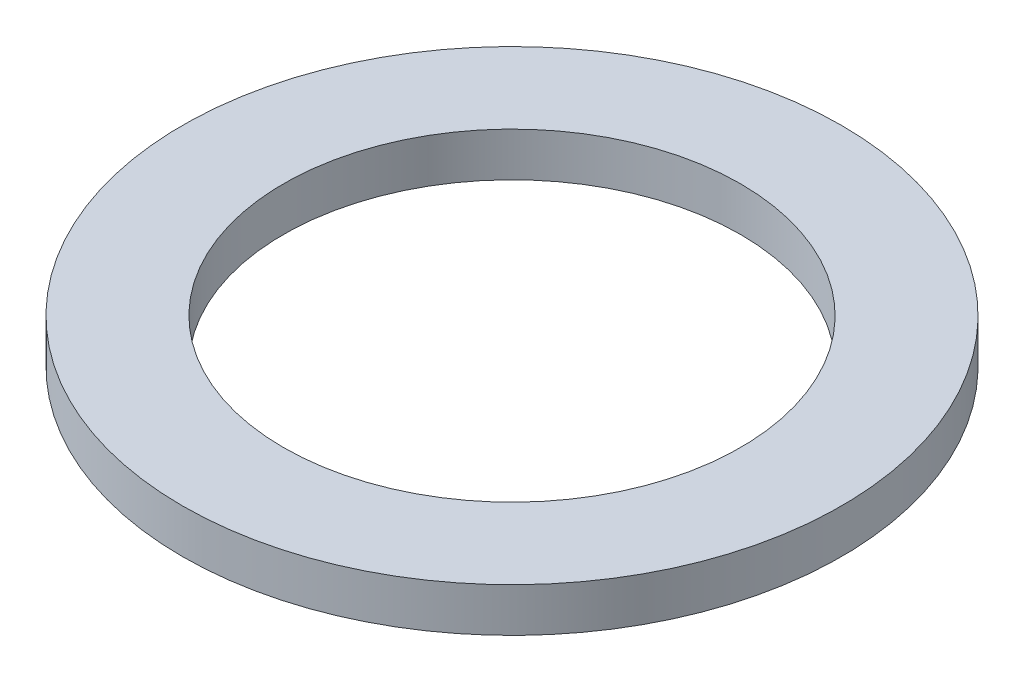
ISO-10303-21;
HEADER;
FILE_DESCRIPTION(('STEP AP214'),'2;1');
FILE_NAME('part.step','',(''),(''),'','','');
FILE_SCHEMA(('AUTOMOTIVE_DESIGN { 1 0 10303 214 1 1 1 1 }'));
ENDSEC;
DATA;
#1=APPLICATION_CONTEXT('core data for automotive mechanical design processes');
#2=APPLICATION_PROTOCOL_DEFINITION('international standard','automotive_design',2000,#1);
#3=PRODUCT_CONTEXT('',#1,'mechanical');
#4=PRODUCT('Part','Part','',(#3));
#5=PRODUCT_RELATED_PRODUCT_CATEGORY('part','',(#4));
#6=PRODUCT_DEFINITION_FORMATION('','',#4);
#7=PRODUCT_DEFINITION_CONTEXT('part definition',#1,'design');
#8=PRODUCT_DEFINITION('design','',#6,#7);
#9=PRODUCT_DEFINITION_SHAPE('','',#8);
#10=(LENGTH_UNIT() NAMED_UNIT(*) SI_UNIT(.MILLI.,.METRE.));
#11=(NAMED_UNIT(*) PLANE_ANGLE_UNIT() SI_UNIT($,.RADIAN.));
#12=(NAMED_UNIT(*) SI_UNIT($,.STERADIAN.) SOLID_ANGLE_UNIT());
#13=UNCERTAINTY_MEASURE_WITH_UNIT(LENGTH_MEASURE(1.E-05),#10,'distance_accuracy_value','');
#14=(GEOMETRIC_REPRESENTATION_CONTEXT(3) GLOBAL_UNCERTAINTY_ASSIGNED_CONTEXT((#13)) GLOBAL_UNIT_ASSIGNED_CONTEXT((#10,
#11,#12)) REPRESENTATION_CONTEXT('',''));
#15=CARTESIAN_POINT('',(0.,0.,0.));
#16=DIRECTION('',(0.,0.,1.));
#17=DIRECTION('',(1.,0.,0.));
#18=AXIS2_PLACEMENT_3D('',#15,#16,#17);
#19=CARTESIAN_POINT('',(0.,1.,0.));
#20=DIRECTION('',(0.,1.,0.));
#21=DIRECTION('',(0.,0.,1.));
#22=AXIS2_PLACEMENT_3D('',#19,#20,#21);
#23=PLANE('',#22);
#24=CARTESIAN_POINT('',(0.,1.,0.));
#25=DIRECTION('',(0.,1.,0.));
#26=DIRECTION('',(0.,0.,1.));
#27=AXIS2_PLACEMENT_3D('',#24,#25,#26);
#28=CIRCLE('',#27,7.5);
#29=CARTESIAN_POINT('',(0.,1.,7.5));
#30=VERTEX_POINT('',#29);
#31=EDGE_CURVE('E10',#30,#30,#28,.T.);
#32=ORIENTED_EDGE('',*,*,#31,.T.);
#33=EDGE_LOOP('',(#32));
#34=FACE_BOUND('',#33,.T.);
#35=CARTESIAN_POINT('',(0.,1.,0.));
#36=DIRECTION('',(0.,1.,0.));
#37=DIRECTION('',(0.,0.,1.));
#38=AXIS2_PLACEMENT_3D('',#35,#36,#37);
#39=CIRCLE('',#38,5.2);
#40=CARTESIAN_POINT('',(0.,1.,5.2));
#41=VERTEX_POINT('',#40);
#42=EDGE_CURVE('E45',#41,#41,#39,.T.);
#43=ORIENTED_EDGE('',*,*,#42,.F.);
#44=EDGE_LOOP('',(#43));
#45=FACE_BOUND('',#44,.T.);
#46=ADVANCED_FACE('F34',(#34,#45),#23,.T.);
#47=CARTESIAN_POINT('',(0.,0.,0.));
#48=DIRECTION('',(0.,1.,0.));
#49=DIRECTION('',(0.,0.,1.));
#50=AXIS2_PLACEMENT_3D('',#47,#48,#49);
#51=PLANE('',#50);
#52=CARTESIAN_POINT('',(0.,0.,0.));
#53=DIRECTION('',(0.,1.,0.));
#54=DIRECTION('',(0.,0.,1.));
#55=AXIS2_PLACEMENT_3D('',#52,#53,#54);
#56=CIRCLE('',#55,7.5);
#57=CARTESIAN_POINT('',(0.,0.,7.5));
#58=VERTEX_POINT('',#57);
#59=EDGE_CURVE('E38',#58,#58,#56,.T.);
#60=ORIENTED_EDGE('',*,*,#59,.F.);
#61=EDGE_LOOP('',(#60));
#62=FACE_BOUND('',#61,.T.);
#63=CARTESIAN_POINT('',(0.,0.,0.));
#64=DIRECTION('',(0.,1.,0.));
#65=DIRECTION('',(0.,0.,1.));
#66=AXIS2_PLACEMENT_3D('',#63,#64,#65);
#67=CIRCLE('',#66,5.2);
#68=CARTESIAN_POINT('',(0.,0.,5.2));
#69=VERTEX_POINT('',#68);
#70=EDGE_CURVE('E47',#69,#69,#67,.T.);
#71=ORIENTED_EDGE('',*,*,#70,.T.);
#72=EDGE_LOOP('',(#71));
#73=FACE_BOUND('',#72,.T.);
#74=ADVANCED_FACE('F57',(#62,#73),#51,.F.);
#75=CARTESIAN_POINT('',(0.,1.,0.));
#76=DIRECTION('',(0.,-1.,0.));
#77=DIRECTION('',(0.,0.,-1.));
#78=AXIS2_PLACEMENT_3D('',#75,#76,#77);
#79=CYLINDRICAL_SURFACE('',#78,7.5);
#80=ORIENTED_EDGE('',*,*,#31,.F.);
#81=EDGE_LOOP('',(#80));
#82=FACE_BOUND('',#81,.T.);
#83=ORIENTED_EDGE('',*,*,#59,.T.);
#84=EDGE_LOOP('',(#83));
#85=FACE_BOUND('',#84,.T.);
#86=ADVANCED_FACE('F36',(#82,#85),#79,.T.);
#87=CARTESIAN_POINT('',(0.,1.,0.));
#88=DIRECTION('',(0.,-1.,0.));
#89=DIRECTION('',(0.,0.,-1.));
#90=AXIS2_PLACEMENT_3D('',#87,#88,#89);
#91=CYLINDRICAL_SURFACE('',#90,5.2);
#92=ORIENTED_EDGE('',*,*,#42,.T.);
#93=EDGE_LOOP('',(#92));
#94=FACE_BOUND('',#93,.T.);
#95=ORIENTED_EDGE('',*,*,#70,.F.);
#96=EDGE_LOOP('',(#95));
#97=FACE_BOUND('',#96,.T.);
#98=ADVANCED_FACE('F53',(#94,#97),#91,.F.);
#99=CLOSED_SHELL('',(#46,#74,#86,#98));
#100=MANIFOLD_SOLID_BREP('B2',#99);
#101=ADVANCED_BREP_SHAPE_REPRESENTATION('',(#18,#100),#14);
#102=SHAPE_DEFINITION_REPRESENTATION(#9,#101);
ENDSEC;
END-ISO-10303-21;
